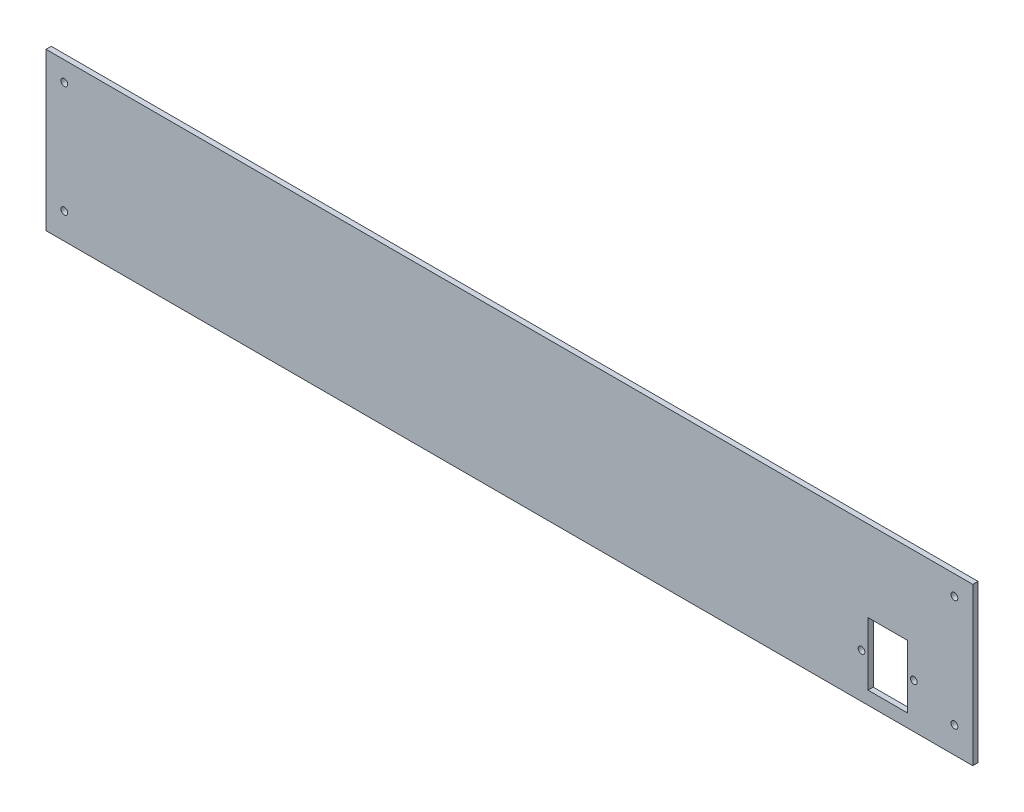
ISO-10303-21;
HEADER;
FILE_DESCRIPTION(('STEP AP214'),'2;1');
FILE_NAME('part.step','',(''),(''),'','','');
FILE_SCHEMA(('AUTOMOTIVE_DESIGN { 1 0 10303 214 1 1 1 1 }'));
ENDSEC;
DATA;
#1=APPLICATION_CONTEXT('core data for automotive mechanical design processes');
#2=APPLICATION_PROTOCOL_DEFINITION('international standard','automotive_design',2000,#1);
#3=PRODUCT_CONTEXT('',#1,'mechanical');
#4=PRODUCT('Part','Part','',(#3));
#5=PRODUCT_RELATED_PRODUCT_CATEGORY('part','',(#4));
#6=PRODUCT_DEFINITION_FORMATION('','',#4);
#7=PRODUCT_DEFINITION_CONTEXT('part definition',#1,'design');
#8=PRODUCT_DEFINITION('design','',#6,#7);
#9=PRODUCT_DEFINITION_SHAPE('','',#8);
#10=(LENGTH_UNIT() NAMED_UNIT(*) SI_UNIT(.MILLI.,.METRE.));
#11=(NAMED_UNIT(*) PLANE_ANGLE_UNIT() SI_UNIT($,.RADIAN.));
#12=(NAMED_UNIT(*) SI_UNIT($,.STERADIAN.) SOLID_ANGLE_UNIT());
#13=UNCERTAINTY_MEASURE_WITH_UNIT(LENGTH_MEASURE(1.E-05),#10,'distance_accuracy_value','');
#14=(GEOMETRIC_REPRESENTATION_CONTEXT(3) GLOBAL_UNCERTAINTY_ASSIGNED_CONTEXT((#13)) GLOBAL_UNIT_ASSIGNED_CONTEXT((#10,
#11,#12)) REPRESENTATION_CONTEXT('',''));
#15=CARTESIAN_POINT('',(0.,0.,0.));
#16=DIRECTION('',(0.,0.,1.));
#17=DIRECTION('',(1.,0.,0.));
#18=AXIS2_PLACEMENT_3D('',#15,#16,#17);
#19=CARTESIAN_POINT('',(0.,0.,4.));
#20=DIRECTION('',(1.,0.,0.));
#21=DIRECTION('',(0.,0.,-1.));
#22=AXIS2_PLACEMENT_3D('',#19,#20,#21);
#23=PLANE('',#22);
#24=DIRECTION('',(0.,-1.,0.));
#25=VECTOR('',#24,1.);
#26=CARTESIAN_POINT('',(0.,0.,0.));
#27=LINE('',#26,#25);
#28=CARTESIAN_POINT('',(0.,120.,0.));
#29=VERTEX_POINT('',#28);
#30=CARTESIAN_POINT('',(0.,0.,0.));
#31=VERTEX_POINT('',#30);
#32=EDGE_CURVE('E156',#29,#31,#27,.T.);
#33=ORIENTED_EDGE('',*,*,#32,.T.);
#34=DIRECTION('',(0.,0.,-1.));
#35=VECTOR('',#34,1.);
#36=CARTESIAN_POINT('',(0.,0.,4.));
#37=LINE('',#36,#35);
#38=CARTESIAN_POINT('',(0.,0.,4.));
#39=VERTEX_POINT('',#38);
#40=EDGE_CURVE('E11',#39,#31,#37,.T.);
#41=ORIENTED_EDGE('',*,*,#40,.F.);
#42=DIRECTION('',(0.,-1.,0.));
#43=VECTOR('',#42,1.);
#44=CARTESIAN_POINT('',(0.,0.,4.));
#45=LINE('',#44,#43);
#46=CARTESIAN_POINT('',(0.,120.,4.));
#47=VERTEX_POINT('',#46);
#48=EDGE_CURVE('E145',#47,#39,#45,.T.);
#49=ORIENTED_EDGE('',*,*,#48,.F.);
#50=DIRECTION('',(0.,0.,-1.));
#51=VECTOR('',#50,1.);
#52=CARTESIAN_POINT('',(0.,120.,4.));
#53=LINE('',#52,#51);
#54=EDGE_CURVE('E155',#47,#29,#53,.T.);
#55=ORIENTED_EDGE('',*,*,#54,.T.);
#56=EDGE_LOOP('',(#33,#41,#49,#55));
#57=FACE_BOUND('',#56,.T.);
#58=ADVANCED_FACE('F39',(#57),#23,.F.);
#59=CARTESIAN_POINT('',(0.,0.,4.));
#60=DIRECTION('',(0.,1.,0.));
#61=DIRECTION('',(0.,0.,1.));
#62=AXIS2_PLACEMENT_3D('',#59,#60,#61);
#63=PLANE('',#62);
#64=DIRECTION('',(1.,0.,0.));
#65=VECTOR('',#64,1.);
#66=CARTESIAN_POINT('',(0.,0.,0.));
#67=LINE('',#66,#65);
#68=CARTESIAN_POINT('',(708.,0.,0.));
#69=VERTEX_POINT('',#68);
#70=EDGE_CURVE('E159',#31,#69,#67,.T.);
#71=ORIENTED_EDGE('',*,*,#70,.T.);
#72=DIRECTION('',(0.,0.,-1.));
#73=VECTOR('',#72,1.);
#74=CARTESIAN_POINT('',(708.,0.,4.));
#75=LINE('',#74,#73);
#76=CARTESIAN_POINT('',(708.,0.,4.));
#77=VERTEX_POINT('',#76);
#78=EDGE_CURVE('E46',#77,#69,#75,.T.);
#79=ORIENTED_EDGE('',*,*,#78,.F.);
#80=DIRECTION('',(1.,0.,0.));
#81=VECTOR('',#80,1.);
#82=CARTESIAN_POINT('',(0.,0.,4.));
#83=LINE('',#82,#81);
#84=EDGE_CURVE('E148',#39,#77,#83,.T.);
#85=ORIENTED_EDGE('',*,*,#84,.F.);
#86=ORIENTED_EDGE('',*,*,#40,.T.);
#87=EDGE_LOOP('',(#71,#79,#85,#86));
#88=FACE_BOUND('',#87,.T.);
#89=ADVANCED_FACE('F189',(#88),#63,.F.);
#90=CARTESIAN_POINT('',(708.,0.,4.));
#91=DIRECTION('',(-1.,0.,0.));
#92=DIRECTION('',(0.,0.,1.));
#93=AXIS2_PLACEMENT_3D('',#90,#91,#92);
#94=PLANE('',#93);
#95=DIRECTION('',(0.,1.,0.));
#96=VECTOR('',#95,1.);
#97=CARTESIAN_POINT('',(708.,0.,0.));
#98=LINE('',#97,#96);
#99=CARTESIAN_POINT('',(708.,120.,0.));
#100=VERTEX_POINT('',#99);
#101=EDGE_CURVE('E162',#69,#100,#98,.T.);
#102=ORIENTED_EDGE('',*,*,#101,.T.);
#103=DIRECTION('',(0.,0.,-1.));
#104=VECTOR('',#103,1.);
#105=CARTESIAN_POINT('',(708.,120.,4.));
#106=LINE('',#105,#104);
#107=CARTESIAN_POINT('',(708.,120.,4.));
#108=VERTEX_POINT('',#107);
#109=EDGE_CURVE('E167',#108,#100,#106,.T.);
#110=ORIENTED_EDGE('',*,*,#109,.F.);
#111=DIRECTION('',(0.,1.,0.));
#112=VECTOR('',#111,1.);
#113=CARTESIAN_POINT('',(708.,0.,4.));
#114=LINE('',#113,#112);
#115=EDGE_CURVE('E151',#77,#108,#114,.T.);
#116=ORIENTED_EDGE('',*,*,#115,.F.);
#117=ORIENTED_EDGE('',*,*,#78,.T.);
#118=EDGE_LOOP('',(#102,#110,#116,#117));
#119=FACE_BOUND('',#118,.T.);
#120=ADVANCED_FACE('F174',(#119),#94,.F.);
#121=CARTESIAN_POINT('',(0.,120.,4.));
#122=DIRECTION('',(0.,-1.,0.));
#123=DIRECTION('',(0.,0.,-1.));
#124=AXIS2_PLACEMENT_3D('',#121,#122,#123);
#125=PLANE('',#124);
#126=DIRECTION('',(-1.,0.,0.));
#127=VECTOR('',#126,1.);
#128=CARTESIAN_POINT('',(0.,120.,0.));
#129=LINE('',#128,#127);
#130=EDGE_CURVE('E149',#100,#29,#129,.T.);
#131=ORIENTED_EDGE('',*,*,#130,.T.);
#132=ORIENTED_EDGE('',*,*,#54,.F.);
#133=DIRECTION('',(-1.,0.,0.));
#134=VECTOR('',#133,1.);
#135=CARTESIAN_POINT('',(0.,120.,4.));
#136=LINE('',#135,#134);
#137=EDGE_CURVE('E153',#108,#47,#136,.T.);
#138=ORIENTED_EDGE('',*,*,#137,.F.);
#139=ORIENTED_EDGE('',*,*,#109,.T.);
#140=EDGE_LOOP('',(#131,#132,#138,#139));
#141=FACE_BOUND('',#140,.T.);
#142=ADVANCED_FACE('F182',(#141),#125,.F.);
#143=CARTESIAN_POINT('',(0.,0.,4.));
#144=DIRECTION('',(0.,0.,-1.));
#145=DIRECTION('',(-1.,0.,0.));
#146=AXIS2_PLACEMENT_3D('',#143,#144,#145);
#147=PLANE('',#146);
#148=CARTESIAN_POINT('',(14.,20.,4.));
#149=DIRECTION('',(0.,0.,-1.));
#150=DIRECTION('',(-1.,0.,0.));
#151=AXIS2_PLACEMENT_3D('',#148,#149,#150);
#152=CIRCLE('',#151,2.60000000000007);
#153=CARTESIAN_POINT('',(11.3999999999999,20.,4.));
#154=VERTEX_POINT('',#153);
#155=EDGE_CURVE('E248',#154,#154,#152,.F.);
#156=ORIENTED_EDGE('',*,*,#155,.F.);
#157=EDGE_LOOP('',(#156));
#158=FACE_BOUND('',#157,.T.);
#159=CARTESIAN_POINT('',(694.,20.,4.));
#160=DIRECTION('',(0.,0.,-1.));
#161=DIRECTION('',(-1.,0.,0.));
#162=AXIS2_PLACEMENT_3D('',#159,#160,#161);
#163=CIRCLE('',#162,2.60000000000007);
#164=CARTESIAN_POINT('',(691.4,20.,4.));
#165=VERTEX_POINT('',#164);
#166=EDGE_CURVE('E252',#165,#165,#163,.T.);
#167=ORIENTED_EDGE('',*,*,#166,.T.);
#168=EDGE_LOOP('',(#167));
#169=FACE_BOUND('',#168,.T.);
#170=CARTESIAN_POINT('',(694.,105.,4.));
#171=DIRECTION('',(0.,0.,-1.));
#172=DIRECTION('',(-1.,0.,0.));
#173=AXIS2_PLACEMENT_3D('',#170,#171,#172);
#174=CIRCLE('',#173,2.60000000000007);
#175=CARTESIAN_POINT('',(691.4,105.,4.));
#176=VERTEX_POINT('',#175);
#177=EDGE_CURVE('E144',#176,#176,#174,.T.);
#178=ORIENTED_EDGE('',*,*,#177,.T.);
#179=EDGE_LOOP('',(#178));
#180=FACE_BOUND('',#179,.T.);
#181=CARTESIAN_POINT('',(14.,105.,4.));
#182=DIRECTION('',(0.,0.,-1.));
#183=DIRECTION('',(-1.,0.,0.));
#184=AXIS2_PLACEMENT_3D('',#181,#182,#183);
#185=CIRCLE('',#184,2.6);
#186=CARTESIAN_POINT('',(11.4,105.,4.));
#187=VERTEX_POINT('',#186);
#188=EDGE_CURVE('E262',#187,#187,#185,.T.);
#189=ORIENTED_EDGE('',*,*,#188,.T.);
#190=EDGE_LOOP('',(#189));
#191=FACE_BOUND('',#190,.T.);
#192=CARTESIAN_POINT('',(663.,34.,4.));
#193=DIRECTION('',(0.,0.,1.));
#194=DIRECTION('',(1.,0.,0.));
#195=AXIS2_PLACEMENT_3D('',#192,#193,#194);
#196=CIRCLE('',#195,2.55000000000005);
#197=CARTESIAN_POINT('',(665.55,34.,4.));
#198=VERTEX_POINT('',#197);
#199=EDGE_CURVE('E160',#198,#198,#196,.T.);
#200=ORIENTED_EDGE('',*,*,#199,.F.);
#201=EDGE_LOOP('',(#200));
#202=FACE_BOUND('',#201,.T.);
#203=DIRECTION('',(1.,0.,0.));
#204=VECTOR('',#203,1.);
#205=CARTESIAN_POINT('',(0.,10.0000000000001,4.));
#206=LINE('',#205,#204);
#207=CARTESIAN_POINT('',(628.,10.,4.));
#208=VERTEX_POINT('',#207);
#209=CARTESIAN_POINT('',(658.,10.,4.));
#210=VERTEX_POINT('',#209);
#211=EDGE_CURVE('E122',#208,#210,#206,.T.);
#212=ORIENTED_EDGE('',*,*,#211,.F.);
#213=DIRECTION('',(0.,-1.,0.));
#214=VECTOR('',#213,1.);
#215=CARTESIAN_POINT('',(628.,-1.45254179055125E-12,4.));
#216=LINE('',#215,#214);
#217=CARTESIAN_POINT('',(628.,58.,4.));
#218=VERTEX_POINT('',#217);
#219=EDGE_CURVE('E53',#218,#208,#216,.T.);
#220=ORIENTED_EDGE('',*,*,#219,.F.);
#221=DIRECTION('',(1.,0.,0.));
#222=VECTOR('',#221,1.);
#223=CARTESIAN_POINT('',(0.,58.,4.));
#224=LINE('',#223,#222);
#225=CARTESIAN_POINT('',(658.,58.,4.));
#226=VERTEX_POINT('',#225);
#227=EDGE_CURVE('E115',#218,#226,#224,.T.);
#228=ORIENTED_EDGE('',*,*,#227,.T.);
#229=DIRECTION('',(0.,-1.,0.));
#230=VECTOR('',#229,1.);
#231=CARTESIAN_POINT('',(658.,1.52193072959032E-12,4.));
#232=LINE('',#231,#230);
#233=EDGE_CURVE('E129',#226,#210,#232,.T.);
#234=ORIENTED_EDGE('',*,*,#233,.T.);
#235=EDGE_LOOP('',(#212,#220,#228,#234));
#236=FACE_BOUND('',#235,.T.);
#237=CARTESIAN_POINT('',(623.,34.,4.));
#238=DIRECTION('',(0.,0.,1.));
#239=DIRECTION('',(1.,0.,0.));
#240=AXIS2_PLACEMENT_3D('',#237,#238,#239);
#241=CIRCLE('',#240,2.55000000000005);
#242=CARTESIAN_POINT('',(625.55,34.,4.));
#243=VERTEX_POINT('',#242);
#244=EDGE_CURVE('E138',#243,#243,#241,.T.);
#245=ORIENTED_EDGE('',*,*,#244,.F.);
#246=EDGE_LOOP('',(#245));
#247=FACE_BOUND('',#246,.T.);
#248=ORIENTED_EDGE('',*,*,#48,.T.);
#249=ORIENTED_EDGE('',*,*,#84,.T.);
#250=ORIENTED_EDGE('',*,*,#115,.T.);
#251=ORIENTED_EDGE('',*,*,#137,.T.);
#252=EDGE_LOOP('',(#248,#249,#250,#251));
#253=FACE_BOUND('',#252,.T.);
#254=ADVANCED_FACE('F188',(#158,#169,#180,#191,#202,#236,#247,#253),#147,.F.);
#255=CARTESIAN_POINT('',(0.,0.,0.));
#256=DIRECTION('',(0.,0.,-1.));
#257=DIRECTION('',(-1.,0.,0.));
#258=AXIS2_PLACEMENT_3D('',#255,#256,#257);
#259=PLANE('',#258);
#260=CARTESIAN_POINT('',(14.,20.,0.));
#261=DIRECTION('',(0.,0.,1.));
#262=DIRECTION('',(1.,0.,0.));
#263=AXIS2_PLACEMENT_3D('',#260,#261,#262);
#264=CIRCLE('',#263,2.60000000000007);
#265=CARTESIAN_POINT('',(16.6000000000001,20.,0.));
#266=VERTEX_POINT('',#265);
#267=EDGE_CURVE('E245',#266,#266,#264,.T.);
#268=ORIENTED_EDGE('',*,*,#267,.T.);
#269=EDGE_LOOP('',(#268));
#270=FACE_BOUND('',#269,.T.);
#271=CARTESIAN_POINT('',(694.,20.,0.));
#272=DIRECTION('',(0.,0.,-1.));
#273=DIRECTION('',(-1.,0.,0.));
#274=AXIS2_PLACEMENT_3D('',#271,#272,#273);
#275=CIRCLE('',#274,2.60000000000007);
#276=CARTESIAN_POINT('',(691.4,20.,0.));
#277=VERTEX_POINT('',#276);
#278=EDGE_CURVE('E249',#277,#277,#275,.T.);
#279=ORIENTED_EDGE('',*,*,#278,.F.);
#280=EDGE_LOOP('',(#279));
#281=FACE_BOUND('',#280,.T.);
#282=CARTESIAN_POINT('',(694.,105.,0.));
#283=DIRECTION('',(0.,0.,-1.));
#284=DIRECTION('',(-1.,0.,0.));
#285=AXIS2_PLACEMENT_3D('',#282,#283,#284);
#286=CIRCLE('',#285,2.60000000000007);
#287=CARTESIAN_POINT('',(691.4,105.,0.));
#288=VERTEX_POINT('',#287);
#289=EDGE_CURVE('E259',#288,#288,#286,.T.);
#290=ORIENTED_EDGE('',*,*,#289,.F.);
#291=EDGE_LOOP('',(#290));
#292=FACE_BOUND('',#291,.T.);
#293=CARTESIAN_POINT('',(14.,105.,0.));
#294=DIRECTION('',(0.,0.,-1.));
#295=DIRECTION('',(-1.,0.,0.));
#296=AXIS2_PLACEMENT_3D('',#293,#294,#295);
#297=CIRCLE('',#296,2.6);
#298=CARTESIAN_POINT('',(11.4,105.,0.));
#299=VERTEX_POINT('',#298);
#300=EDGE_CURVE('E258',#299,#299,#297,.T.);
#301=ORIENTED_EDGE('',*,*,#300,.F.);
#302=EDGE_LOOP('',(#301));
#303=FACE_BOUND('',#302,.T.);
#304=CARTESIAN_POINT('',(663.,34.,0.));
#305=DIRECTION('',(0.,0.,-1.));
#306=DIRECTION('',(-1.,0.,0.));
#307=AXIS2_PLACEMENT_3D('',#304,#305,#306);
#308=CIRCLE('',#307,2.55000000000005);
#309=CARTESIAN_POINT('',(660.45,34.,0.));
#310=VERTEX_POINT('',#309);
#311=EDGE_CURVE('E109',#310,#310,#308,.F.);
#312=ORIENTED_EDGE('',*,*,#311,.T.);
#313=EDGE_LOOP('',(#312));
#314=FACE_BOUND('',#313,.T.);
#315=DIRECTION('',(0.,-1.,0.));
#316=VECTOR('',#315,1.);
#317=CARTESIAN_POINT('',(628.,-1.45254179055125E-12,0.));
#318=LINE('',#317,#316);
#319=CARTESIAN_POINT('',(628.,58.,0.));
#320=VERTEX_POINT('',#319);
#321=CARTESIAN_POINT('',(628.,10.,0.));
#322=VERTEX_POINT('',#321);
#323=EDGE_CURVE('E113',#320,#322,#318,.T.);
#324=ORIENTED_EDGE('',*,*,#323,.T.);
#325=DIRECTION('',(1.,0.,0.));
#326=VECTOR('',#325,1.);
#327=CARTESIAN_POINT('',(0.,10.0000000000001,0.));
#328=LINE('',#327,#326);
#329=CARTESIAN_POINT('',(658.,10.,0.));
#330=VERTEX_POINT('',#329);
#331=EDGE_CURVE('E102',#322,#330,#328,.T.);
#332=ORIENTED_EDGE('',*,*,#331,.T.);
#333=DIRECTION('',(0.,-1.,0.));
#334=VECTOR('',#333,1.);
#335=CARTESIAN_POINT('',(658.,1.52193072959032E-12,0.));
#336=LINE('',#335,#334);
#337=CARTESIAN_POINT('',(658.,58.,0.));
#338=VERTEX_POINT('',#337);
#339=EDGE_CURVE('E124',#338,#330,#336,.T.);
#340=ORIENTED_EDGE('',*,*,#339,.F.);
#341=DIRECTION('',(1.,0.,0.));
#342=VECTOR('',#341,1.);
#343=CARTESIAN_POINT('',(0.,58.,0.));
#344=LINE('',#343,#342);
#345=EDGE_CURVE('E120',#320,#338,#344,.T.);
#346=ORIENTED_EDGE('',*,*,#345,.F.);
#347=EDGE_LOOP('',(#324,#332,#340,#346));
#348=FACE_BOUND('',#347,.T.);
#349=CARTESIAN_POINT('',(623.,34.,0.));
#350=DIRECTION('',(0.,0.,-1.));
#351=DIRECTION('',(-1.,0.,0.));
#352=AXIS2_PLACEMENT_3D('',#349,#350,#351);
#353=CIRCLE('',#352,2.55000000000005);
#354=CARTESIAN_POINT('',(620.45,34.,0.));
#355=VERTEX_POINT('',#354);
#356=EDGE_CURVE('E141',#355,#355,#353,.F.);
#357=ORIENTED_EDGE('',*,*,#356,.T.);
#358=EDGE_LOOP('',(#357));
#359=FACE_BOUND('',#358,.T.);
#360=ORIENTED_EDGE('',*,*,#32,.F.);
#361=ORIENTED_EDGE('',*,*,#130,.F.);
#362=ORIENTED_EDGE('',*,*,#101,.F.);
#363=ORIENTED_EDGE('',*,*,#70,.F.);
#364=EDGE_LOOP('',(#360,#361,#362,#363));
#365=FACE_BOUND('',#364,.T.);
#366=ADVANCED_FACE('F118',(#270,#281,#292,#303,#314,#348,#359,#365),#259,.T.);
#367=CARTESIAN_POINT('',(623.,34.,-0.00100000000000013));
#368=DIRECTION('',(0.,0.,1.));
#369=DIRECTION('',(1.,0.,0.));
#370=AXIS2_PLACEMENT_3D('',#367,#368,#369);
#371=CYLINDRICAL_SURFACE('',#370,2.55000000000005);
#372=ORIENTED_EDGE('',*,*,#356,.F.);
#373=EDGE_LOOP('',(#372));
#374=FACE_BOUND('',#373,.T.);
#375=ORIENTED_EDGE('',*,*,#244,.T.);
#376=EDGE_LOOP('',(#375));
#377=FACE_BOUND('',#376,.T.);
#378=ADVANCED_FACE('F201',(#374,#377),#371,.F.);
#379=CARTESIAN_POINT('',(628.,-1.45254179055125E-12,-0.00100000000000013));
#380=DIRECTION('',(-1.,0.,0.));
#381=DIRECTION('',(0.,-1.,0.));
#382=AXIS2_PLACEMENT_3D('',#379,#380,#381);
#383=PLANE('',#382);
#384=DIRECTION('',(0.,0.,1.));
#385=VECTOR('',#384,1.);
#386=CARTESIAN_POINT('',(628.,58.,-0.00100000000000013));
#387=LINE('',#386,#385);
#388=EDGE_CURVE('E110',#320,#218,#387,.T.);
#389=ORIENTED_EDGE('',*,*,#388,.T.);
#390=ORIENTED_EDGE('',*,*,#219,.T.);
#391=DIRECTION('',(0.,0.,1.));
#392=VECTOR('',#391,1.);
#393=CARTESIAN_POINT('',(628.,10.,-0.00100000000000013));
#394=LINE('',#393,#392);
#395=EDGE_CURVE('E104',#322,#208,#394,.T.);
#396=ORIENTED_EDGE('',*,*,#395,.F.);
#397=ORIENTED_EDGE('',*,*,#323,.F.);
#398=EDGE_LOOP('',(#389,#390,#396,#397));
#399=FACE_BOUND('',#398,.T.);
#400=ADVANCED_FACE('F112',(#399),#383,.F.);
#401=CARTESIAN_POINT('',(0.,58.,-0.00100000000000013));
#402=DIRECTION('',(0.,-1.,0.));
#403=DIRECTION('',(0.,0.,-1.));
#404=AXIS2_PLACEMENT_3D('',#401,#402,#403);
#405=PLANE('',#404);
#406=ORIENTED_EDGE('',*,*,#345,.T.);
#407=DIRECTION('',(0.,0.,1.));
#408=VECTOR('',#407,1.);
#409=CARTESIAN_POINT('',(658.,58.,-0.00100000000000013));
#410=LINE('',#409,#408);
#411=EDGE_CURVE('E135',#338,#226,#410,.T.);
#412=ORIENTED_EDGE('',*,*,#411,.T.);
#413=ORIENTED_EDGE('',*,*,#227,.F.);
#414=ORIENTED_EDGE('',*,*,#388,.F.);
#415=EDGE_LOOP('',(#406,#412,#413,#414));
#416=FACE_BOUND('',#415,.T.);
#417=ADVANCED_FACE('F211',(#416),#405,.T.);
#418=CARTESIAN_POINT('',(658.,1.52193072959032E-12,-0.00100000000000013));
#419=DIRECTION('',(-1.,0.,0.));
#420=DIRECTION('',(0.,-1.,0.));
#421=AXIS2_PLACEMENT_3D('',#418,#419,#420);
#422=PLANE('',#421);
#423=ORIENTED_EDGE('',*,*,#339,.T.);
#424=DIRECTION('',(0.,0.,1.));
#425=VECTOR('',#424,1.);
#426=CARTESIAN_POINT('',(658.,10.,-0.00100000000000013));
#427=LINE('',#426,#425);
#428=EDGE_CURVE('E61',#330,#210,#427,.T.);
#429=ORIENTED_EDGE('',*,*,#428,.T.);
#430=ORIENTED_EDGE('',*,*,#233,.F.);
#431=ORIENTED_EDGE('',*,*,#411,.F.);
#432=EDGE_LOOP('',(#423,#429,#430,#431));
#433=FACE_BOUND('',#432,.T.);
#434=ADVANCED_FACE('F215',(#433),#422,.T.);
#435=CARTESIAN_POINT('',(0.,10.0000000000001,-0.00100000000000013));
#436=DIRECTION('',(0.,-1.,0.));
#437=DIRECTION('',(1.,0.,0.));
#438=AXIS2_PLACEMENT_3D('',#435,#436,#437);
#439=PLANE('',#438);
#440=ORIENTED_EDGE('',*,*,#395,.T.);
#441=ORIENTED_EDGE('',*,*,#211,.T.);
#442=ORIENTED_EDGE('',*,*,#428,.F.);
#443=ORIENTED_EDGE('',*,*,#331,.F.);
#444=EDGE_LOOP('',(#440,#441,#442,#443));
#445=FACE_BOUND('',#444,.T.);
#446=ADVANCED_FACE('F103',(#445),#439,.F.);
#447=CARTESIAN_POINT('',(663.,34.,-0.00100000000000013));
#448=DIRECTION('',(0.,0.,1.));
#449=DIRECTION('',(1.,0.,0.));
#450=AXIS2_PLACEMENT_3D('',#447,#448,#449);
#451=CYLINDRICAL_SURFACE('',#450,2.55000000000005);
#452=ORIENTED_EDGE('',*,*,#311,.F.);
#453=EDGE_LOOP('',(#452));
#454=FACE_BOUND('',#453,.T.);
#455=ORIENTED_EDGE('',*,*,#199,.T.);
#456=EDGE_LOOP('',(#455));
#457=FACE_BOUND('',#456,.T.);
#458=ADVANCED_FACE('F214',(#454,#457),#451,.F.);
#459=CARTESIAN_POINT('',(14.,105.,10.));
#460=DIRECTION('',(0.,0.,-1.));
#461=DIRECTION('',(-1.,0.,0.));
#462=AXIS2_PLACEMENT_3D('',#459,#460,#461);
#463=CYLINDRICAL_SURFACE('',#462,2.6);
#464=ORIENTED_EDGE('',*,*,#300,.T.);
#465=EDGE_LOOP('',(#464));
#466=FACE_BOUND('',#465,.T.);
#467=ORIENTED_EDGE('',*,*,#188,.F.);
#468=EDGE_LOOP('',(#467));
#469=FACE_BOUND('',#468,.T.);
#470=ADVANCED_FACE('F224',(#466,#469),#463,.F.);
#471=CARTESIAN_POINT('',(694.,105.,10.));
#472=DIRECTION('',(0.,0.,-1.));
#473=DIRECTION('',(-1.,0.,0.));
#474=AXIS2_PLACEMENT_3D('',#471,#472,#473);
#475=CYLINDRICAL_SURFACE('',#474,2.60000000000007);
#476=ORIENTED_EDGE('',*,*,#289,.T.);
#477=EDGE_LOOP('',(#476));
#478=FACE_BOUND('',#477,.T.);
#479=ORIENTED_EDGE('',*,*,#177,.F.);
#480=EDGE_LOOP('',(#479));
#481=FACE_BOUND('',#480,.T.);
#482=ADVANCED_FACE('F228',(#478,#481),#475,.F.);
#483=CARTESIAN_POINT('',(694.,20.,10.));
#484=DIRECTION('',(0.,0.,-1.));
#485=DIRECTION('',(-1.,0.,0.));
#486=AXIS2_PLACEMENT_3D('',#483,#484,#485);
#487=CYLINDRICAL_SURFACE('',#486,2.60000000000007);
#488=ORIENTED_EDGE('',*,*,#278,.T.);
#489=EDGE_LOOP('',(#488));
#490=FACE_BOUND('',#489,.T.);
#491=ORIENTED_EDGE('',*,*,#166,.F.);
#492=EDGE_LOOP('',(#491));
#493=FACE_BOUND('',#492,.T.);
#494=ADVANCED_FACE('F232',(#490,#493),#487,.F.);
#495=CARTESIAN_POINT('',(14.,20.,10.));
#496=DIRECTION('',(0.,0.,-1.));
#497=DIRECTION('',(-1.,0.,0.));
#498=AXIS2_PLACEMENT_3D('',#495,#496,#497);
#499=CYLINDRICAL_SURFACE('',#498,2.60000000000007);
#500=ORIENTED_EDGE('',*,*,#267,.F.);
#501=EDGE_LOOP('',(#500));
#502=FACE_BOUND('',#501,.T.);
#503=ORIENTED_EDGE('',*,*,#155,.T.);
#504=EDGE_LOOP('',(#503));
#505=FACE_BOUND('',#504,.T.);
#506=ADVANCED_FACE('F236',(#502,#505),#499,.F.);
#507=CLOSED_SHELL('',(#58,#89,#120,#142,#254,#366,#378,#400,#417,#434,#446,#458,#470,#482,#494,#506));
#508=MANIFOLD_SOLID_BREP('B2',#507);
#509=ADVANCED_BREP_SHAPE_REPRESENTATION('',(#18,#508),#14);
#510=SHAPE_DEFINITION_REPRESENTATION(#9,#509);
ENDSEC;
END-ISO-10303-21;
